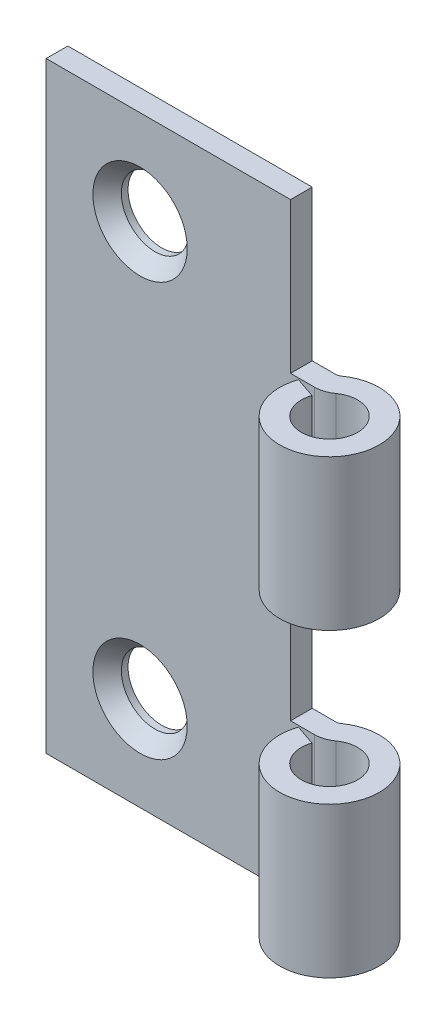
ISO-10303-21;
HEADER;
FILE_DESCRIPTION(('STEP AP214'),'2;1');
FILE_NAME('part.step','',(''),(''),'','','');
FILE_SCHEMA(('AUTOMOTIVE_DESIGN { 1 0 10303 214 1 1 1 1 }'));
ENDSEC;
DATA;
#1=APPLICATION_CONTEXT('core data for automotive mechanical design processes');
#2=APPLICATION_PROTOCOL_DEFINITION('international standard','automotive_design',2000,#1);
#3=PRODUCT_CONTEXT('',#1,'mechanical');
#4=PRODUCT('Part','Part','',(#3));
#5=PRODUCT_RELATED_PRODUCT_CATEGORY('part','',(#4));
#6=PRODUCT_DEFINITION_FORMATION('','',#4);
#7=PRODUCT_DEFINITION_CONTEXT('part definition',#1,'design');
#8=PRODUCT_DEFINITION('design','',#6,#7);
#9=PRODUCT_DEFINITION_SHAPE('','',#8);
#10=(LENGTH_UNIT() NAMED_UNIT(*) SI_UNIT(.MILLI.,.METRE.));
#11=(NAMED_UNIT(*) PLANE_ANGLE_UNIT() SI_UNIT($,.RADIAN.));
#12=(NAMED_UNIT(*) SI_UNIT($,.STERADIAN.) SOLID_ANGLE_UNIT());
#13=UNCERTAINTY_MEASURE_WITH_UNIT(LENGTH_MEASURE(1.E-05),#10,'distance_accuracy_value','');
#14=(GEOMETRIC_REPRESENTATION_CONTEXT(3) GLOBAL_UNCERTAINTY_ASSIGNED_CONTEXT((#13)) GLOBAL_UNIT_ASSIGNED_CONTEXT((#10,
#11,#12)) REPRESENTATION_CONTEXT('',''));
#15=CARTESIAN_POINT('',(0.,0.,0.));
#16=DIRECTION('',(0.,0.,1.));
#17=DIRECTION('',(1.,0.,0.));
#18=AXIS2_PLACEMENT_3D('',#15,#16,#17);
#19=CARTESIAN_POINT('',(-2.7667351517628,25.4,-3.8608));
#20=DIRECTION('',(0.,-1.,0.));
#21=DIRECTION('',(0.,0.,-1.));
#22=AXIS2_PLACEMENT_3D('',#19,#20,#21);
#23=CYLINDRICAL_SURFACE('',#22,2.3749);
#24=DIRECTION('',(0.,-1.,0.));
#25=VECTOR('',#24,1.);
#26=CARTESIAN_POINT('',(-1.38336757588139,25.4,-1.9304));
#27=LINE('',#26,#25);
#28=CARTESIAN_POINT('',(-1.3833675758814,-12.7,-1.9304));
#29=VERTEX_POINT('',#28);
#30=CARTESIAN_POINT('',(-1.3833675758814,-25.4,-1.9304));
#31=VERTEX_POINT('',#30);
#32=EDGE_CURVE('E209',#29,#31,#27,.T.);
#33=ORIENTED_EDGE('',*,*,#32,.F.);
#34=CARTESIAN_POINT('',(-2.7667351517628,-12.7,-3.8608));
#35=DIRECTION('',(0.,1.,0.));
#36=DIRECTION('',(0.,0.,1.));
#37=AXIS2_PLACEMENT_3D('',#34,#35,#36);
#38=CIRCLE('',#37,2.3749);
#39=CARTESIAN_POINT('',(-2.7667351517628,-12.7,-1.4859));
#40=VERTEX_POINT('',#39);
#41=EDGE_CURVE('E266',#29,#40,#38,.F.);
#42=ORIENTED_EDGE('',*,*,#41,.T.);
#43=DIRECTION('',(0.,-1.,0.));
#44=VECTOR('',#43,1.);
#45=CARTESIAN_POINT('',(-2.7667351517628,25.4,-1.4859));
#46=LINE('',#45,#44);
#47=CARTESIAN_POINT('',(-2.7667351517628,-25.4,-1.4859));
#48=VERTEX_POINT('',#47);
#49=EDGE_CURVE('E213',#40,#48,#46,.T.);
#50=ORIENTED_EDGE('',*,*,#49,.T.);
#51=CARTESIAN_POINT('',(-2.7667351517628,-25.4,-3.8608));
#52=DIRECTION('',(0.,-1.,0.));
#53=DIRECTION('',(0.,0.,-1.));
#54=AXIS2_PLACEMENT_3D('',#51,#52,#53);
#55=CIRCLE('',#54,2.3749);
#56=EDGE_CURVE('E307',#31,#48,#55,.T.);
#57=ORIENTED_EDGE('',*,*,#56,.F.);
#58=EDGE_LOOP('',(#33,#42,#50,#57));
#59=FACE_BOUND('',#58,.T.);
#60=ADVANCED_FACE('F41',(#59),#23,.T.);
#61=CARTESIAN_POINT('',(0.,25.4,0.));
#62=DIRECTION('',(0.,-1.,0.));
#63=DIRECTION('',(0.,0.,-1.));
#64=AXIS2_PLACEMENT_3D('',#61,#62,#63);
#65=CYLINDRICAL_SURFACE('',#64,2.3749);
#66=DIRECTION('',(0.,-1.,0.));
#67=VECTOR('',#66,1.);
#68=CARTESIAN_POINT('',(-2.24738976218141,25.4,-0.767716918429001));
#69=LINE('',#68,#67);
#70=CARTESIAN_POINT('',(-2.24738976218141,-12.7,-0.767716918429002));
#71=VERTEX_POINT('',#70);
#72=CARTESIAN_POINT('',(-2.24738976218141,-25.4,-0.767716918429002));
#73=VERTEX_POINT('',#72);
#74=EDGE_CURVE('E205',#71,#73,#69,.T.);
#75=ORIENTED_EDGE('',*,*,#74,.F.);
#76=CARTESIAN_POINT('',(0.,-12.7,0.));
#77=DIRECTION('',(0.,1.,0.));
#78=DIRECTION('',(0.,0.,1.));
#79=AXIS2_PLACEMENT_3D('',#76,#77,#78);
#80=CIRCLE('',#79,2.3749);
#81=EDGE_CURVE('E269',#71,#29,#80,.T.);
#82=ORIENTED_EDGE('',*,*,#81,.T.);
#83=ORIENTED_EDGE('',*,*,#32,.T.);
#84=CARTESIAN_POINT('',(0.,-25.4,0.));
#85=DIRECTION('',(0.,1.,0.));
#86=DIRECTION('',(0.,0.,1.));
#87=AXIS2_PLACEMENT_3D('',#84,#85,#86);
#88=CIRCLE('',#87,2.3749);
#89=EDGE_CURVE('E310',#73,#31,#88,.T.);
#90=ORIENTED_EDGE('',*,*,#89,.F.);
#91=EDGE_LOOP('',(#75,#82,#83,#90));
#92=FACE_BOUND('',#91,.T.);
#93=ADVANCED_FACE('F380',(#92),#65,.F.);
#94=CARTESIAN_POINT('',(-3.97800006033181,25.4,-1.3589));
#95=DIRECTION('',(0.323262839879153,0.,-0.946309218148732));
#96=DIRECTION('',(-0.946309218148733,0.,-0.323262839879153));
#97=AXIS2_PLACEMENT_3D('',#94,#95,#96);
#98=PLANE('',#97);
#99=DIRECTION('',(0.,-1.,0.));
#100=VECTOR('',#99,1.);
#101=CARTESIAN_POINT('',(-3.97800006033181,25.4,-1.3589));
#102=LINE('',#101,#100);
#103=CARTESIAN_POINT('',(-3.97800006033181,-12.7,-1.3589));
#104=VERTEX_POINT('',#103);
#105=CARTESIAN_POINT('',(-3.97800006033182,-25.4,-1.3589));
#106=VERTEX_POINT('',#105);
#107=EDGE_CURVE('E197',#104,#106,#102,.T.);
#108=ORIENTED_EDGE('',*,*,#107,.F.);
#109=DIRECTION('',(0.946309218148733,0.,0.323262839879153));
#110=VECTOR('',#109,1.);
#111=CARTESIAN_POINT('',(-3.97800006033181,-12.7,-1.3589));
#112=LINE('',#111,#110);
#113=EDGE_CURVE('E174',#104,#71,#112,.T.);
#114=ORIENTED_EDGE('',*,*,#113,.T.);
#115=ORIENTED_EDGE('',*,*,#74,.T.);
#116=DIRECTION('',(0.946309218148732,0.,0.323262839879153));
#117=VECTOR('',#116,1.);
#118=CARTESIAN_POINT('',(-3.97800006033182,-25.4,-1.3589));
#119=LINE('',#118,#117);
#120=EDGE_CURVE('E313',#106,#73,#119,.T.);
#121=ORIENTED_EDGE('',*,*,#120,.F.);
#122=EDGE_LOOP('',(#108,#114,#115,#121));
#123=FACE_BOUND('',#122,.T.);
#124=ADVANCED_FACE('F383',(#123),#98,.T.);
#125=CARTESIAN_POINT('',(0.,25.4,0.));
#126=DIRECTION('',(0.,-1.,0.));
#127=DIRECTION('',(0.,0.,-1.));
#128=AXIS2_PLACEMENT_3D('',#125,#126,#127);
#129=CYLINDRICAL_SURFACE('',#128,4.2037);
#130=DIRECTION('',(0.,-1.,0.));
#131=VECTOR('',#130,1.);
#132=CARTESIAN_POINT('',(-2.44863458618579,25.4,-3.41691122994652));
#133=LINE('',#132,#131);
#134=CARTESIAN_POINT('',(-2.4486345861858,-12.7,-3.41691122994652));
#135=VERTEX_POINT('',#134);
#136=CARTESIAN_POINT('',(-2.4486345861858,-25.4,-3.41691122994652));
#137=VERTEX_POINT('',#136);
#138=EDGE_CURVE('E184',#135,#137,#133,.T.);
#139=ORIENTED_EDGE('',*,*,#138,.F.);
#140=CARTESIAN_POINT('',(0.,-12.7,0.));
#141=DIRECTION('',(0.,1.,0.));
#142=DIRECTION('',(0.,0.,1.));
#143=AXIS2_PLACEMENT_3D('',#140,#141,#142);
#144=CIRCLE('',#143,4.20369999999999);
#145=EDGE_CURVE('E168',#104,#135,#144,.T.);
#146=ORIENTED_EDGE('',*,*,#145,.F.);
#147=ORIENTED_EDGE('',*,*,#107,.T.);
#148=CARTESIAN_POINT('',(0.,-25.4,0.));
#149=DIRECTION('',(0.,1.,0.));
#150=DIRECTION('',(1.,0.,0.));
#151=AXIS2_PLACEMENT_3D('',#148,#149,#150);
#152=CIRCLE('',#151,4.2037);
#153=EDGE_CURVE('E191',#106,#137,#152,.T.);
#154=ORIENTED_EDGE('',*,*,#153,.T.);
#155=EDGE_LOOP('',(#139,#146,#147,#154));
#156=FACE_BOUND('',#155,.T.);
#157=ADVANCED_FACE('F189',(#156),#129,.T.);
#158=CARTESIAN_POINT('',(-2.7667351517628,25.4,-3.8608));
#159=DIRECTION('',(0.,-1.,0.));
#160=DIRECTION('',(0.,0.,-1.));
#161=AXIS2_PLACEMENT_3D('',#158,#159,#160);
#162=CYLINDRICAL_SURFACE('',#161,0.5461);
#163=CARTESIAN_POINT('',(-2.7667351517628,-12.7,-3.8608));
#164=DIRECTION('',(0.,-1.,0.));
#165=DIRECTION('',(0.,0.,1.));
#166=AXIS2_PLACEMENT_3D('',#163,#164,#165);
#167=CIRCLE('',#166,0.5461);
#168=CARTESIAN_POINT('',(-2.7667351517628,-12.7,-3.3147));
#169=VERTEX_POINT('',#168);
#170=EDGE_CURVE('E171',#135,#169,#167,.T.);
#171=ORIENTED_EDGE('',*,*,#170,.F.);
#172=ORIENTED_EDGE('',*,*,#138,.T.);
#173=CARTESIAN_POINT('',(-2.7667351517628,-25.4,-3.8608));
#174=DIRECTION('',(0.,1.,0.));
#175=DIRECTION('',(1.,0.,0.));
#176=AXIS2_PLACEMENT_3D('',#173,#174,#175);
#177=CIRCLE('',#176,0.5461);
#178=CARTESIAN_POINT('',(-2.7667351517628,-25.4,-3.3147));
#179=VERTEX_POINT('',#178);
#180=EDGE_CURVE('E317',#137,#179,#177,.F.);
#181=ORIENTED_EDGE('',*,*,#180,.T.);
#182=DIRECTION('',(0.,-1.,0.));
#183=VECTOR('',#182,1.);
#184=CARTESIAN_POINT('',(-2.7667351517628,25.4,-3.3147));
#185=LINE('',#184,#183);
#186=EDGE_CURVE('E186',#169,#179,#185,.T.);
#187=ORIENTED_EDGE('',*,*,#186,.F.);
#188=EDGE_LOOP('',(#171,#172,#181,#187));
#189=FACE_BOUND('',#188,.T.);
#190=ADVANCED_FACE('F182',(#189),#162,.F.);
#191=CARTESIAN_POINT('',(-2.7667351517628,25.4,-3.3147));
#192=DIRECTION('',(0.,0.,1.));
#193=DIRECTION('',(1.,0.,0.));
#194=AXIS2_PLACEMENT_3D('',#191,#192,#193);
#195=PLANE('',#194);
#196=CARTESIAN_POINT('',(-17.4752,17.4498,-3.3147));
#197=DIRECTION('',(0.,0.,1.));
#198=DIRECTION('',(1.,0.,0.));
#199=AXIS2_PLACEMENT_3D('',#196,#197,#198);
#200=CIRCLE('',#199,2.8448);
#201=CARTESIAN_POINT('',(-14.6304,17.4498,-3.3147));
#202=VERTEX_POINT('',#201);
#203=EDGE_CURVE('E238',#202,#202,#200,.T.);
#204=ORIENTED_EDGE('',*,*,#203,.T.);
#205=EDGE_LOOP('',(#204));
#206=FACE_BOUND('',#205,.T.);
#207=CARTESIAN_POINT('',(-17.4752,-17.4498,-3.3147));
#208=DIRECTION('',(0.,0.,1.));
#209=DIRECTION('',(1.,0.,0.));
#210=AXIS2_PLACEMENT_3D('',#207,#208,#209);
#211=CIRCLE('',#210,2.8448);
#212=CARTESIAN_POINT('',(-14.6304,-17.4498,-3.3147));
#213=VERTEX_POINT('',#212);
#214=EDGE_CURVE('E227',#213,#213,#211,.T.);
#215=ORIENTED_EDGE('',*,*,#214,.T.);
#216=EDGE_LOOP('',(#215));
#217=FACE_BOUND('',#216,.T.);
#218=DIRECTION('',(-1.,0.,0.));
#219=VECTOR('',#218,1.);
#220=CARTESIAN_POINT('',(-3.97800006033181,-12.7,-3.3147));
#221=LINE('',#220,#219);
#222=CARTESIAN_POINT('',(-4.77175006033182,-12.7,-3.3147));
#223=VERTEX_POINT('',#222);
#224=EDGE_CURVE('E187',#169,#223,#221,.T.);
#225=ORIENTED_EDGE('',*,*,#224,.F.);
#226=ORIENTED_EDGE('',*,*,#186,.T.);
#227=DIRECTION('',(-1.,0.,0.));
#228=VECTOR('',#227,1.);
#229=CARTESIAN_POINT('',(-2.7667351517628,-25.4,-3.3147));
#230=LINE('',#229,#228);
#231=CARTESIAN_POINT('',(-25.4,-25.4,-3.3147));
#232=VERTEX_POINT('',#231);
#233=EDGE_CURVE('E298',#179,#232,#230,.T.);
#234=ORIENTED_EDGE('',*,*,#233,.T.);
#235=DIRECTION('',(0.,-1.,0.));
#236=VECTOR('',#235,1.);
#237=CARTESIAN_POINT('',(-25.4,25.4,-3.3147));
#238=LINE('',#237,#236);
#239=CARTESIAN_POINT('',(-25.4,25.4,-3.3147));
#240=VERTEX_POINT('',#239);
#241=EDGE_CURVE('E219',#240,#232,#238,.T.);
#242=ORIENTED_EDGE('',*,*,#241,.F.);
#243=DIRECTION('',(-1.,0.,0.));
#244=VECTOR('',#243,1.);
#245=CARTESIAN_POINT('',(-2.7667351517628,25.4,-3.3147));
#246=LINE('',#245,#244);
#247=CARTESIAN_POINT('',(-4.77175006033181,25.4,-3.3147));
#248=VERTEX_POINT('',#247);
#249=EDGE_CURVE('E319',#248,#240,#246,.T.);
#250=ORIENTED_EDGE('',*,*,#249,.F.);
#251=DIRECTION('',(0.,1.,0.));
#252=VECTOR('',#251,1.);
#253=CARTESIAN_POINT('',(-4.77175006033181,12.7,-3.3147));
#254=LINE('',#253,#252);
#255=CARTESIAN_POINT('',(-4.77175006033181,12.7,-3.3147));
#256=VERTEX_POINT('',#255);
#257=EDGE_CURVE('E58',#256,#248,#254,.T.);
#258=ORIENTED_EDGE('',*,*,#257,.F.);
#259=DIRECTION('',(-1.,0.,0.));
#260=VECTOR('',#259,1.);
#261=CARTESIAN_POINT('',(-3.97800006033181,12.7,-3.3147));
#262=LINE('',#261,#260);
#263=CARTESIAN_POINT('',(-2.7667351517628,12.7,-3.3147));
#264=VERTEX_POINT('',#263);
#265=EDGE_CURVE('E278',#264,#256,#262,.T.);
#266=ORIENTED_EDGE('',*,*,#265,.F.);
#267=CARTESIAN_POINT('',(-2.7667351517628,0.,-3.3147));
#268=VERTEX_POINT('',#267);
#269=EDGE_CURVE('E194',#264,#268,#185,.T.);
#270=ORIENTED_EDGE('',*,*,#269,.T.);
#271=DIRECTION('',(-1.,0.,0.));
#272=VECTOR('',#271,1.);
#273=CARTESIAN_POINT('',(-4.77175006033181,0.,-3.3147));
#274=LINE('',#273,#272);
#275=CARTESIAN_POINT('',(-4.77175006033181,0.,-3.3147));
#276=VERTEX_POINT('',#275);
#277=EDGE_CURVE('E251',#268,#276,#274,.T.);
#278=ORIENTED_EDGE('',*,*,#277,.T.);
#279=DIRECTION('',(0.,1.,0.));
#280=VECTOR('',#279,1.);
#281=CARTESIAN_POINT('',(-4.77175006033182,-12.7,-3.3147));
#282=LINE('',#281,#280);
#283=EDGE_CURVE('E246',#223,#276,#282,.T.);
#284=ORIENTED_EDGE('',*,*,#283,.F.);
#285=EDGE_LOOP('',(#225,#226,#234,#242,#250,#258,#266,#270,#278,#284));
#286=FACE_BOUND('',#285,.T.);
#287=ADVANCED_FACE('F43',(#206,#217,#286),#195,.F.);
#288=CARTESIAN_POINT('',(-2.7667351517628,25.4,-1.4859));
#289=DIRECTION('',(0.,0.,1.));
#290=DIRECTION('',(1.,0.,0.));
#291=AXIS2_PLACEMENT_3D('',#288,#289,#290);
#292=PLANE('',#291);
#293=CARTESIAN_POINT('',(-17.4752,-17.4498,-1.4859));
#294=DIRECTION('',(0.,0.,1.));
#295=DIRECTION('',(1.,0.,0.));
#296=AXIS2_PLACEMENT_3D('',#293,#294,#295);
#297=CIRCLE('',#296,3.98272);
#298=CARTESIAN_POINT('',(-13.49248,-17.4498,-1.4859));
#299=VERTEX_POINT('',#298);
#300=EDGE_CURVE('E223',#299,#299,#297,.T.);
#301=ORIENTED_EDGE('',*,*,#300,.F.);
#302=EDGE_LOOP('',(#301));
#303=FACE_BOUND('',#302,.T.);
#304=CARTESIAN_POINT('',(-17.4752,17.4498,-1.4859));
#305=DIRECTION('',(0.,0.,1.));
#306=DIRECTION('',(1.,0.,0.));
#307=AXIS2_PLACEMENT_3D('',#304,#305,#306);
#308=CIRCLE('',#307,3.98272);
#309=CARTESIAN_POINT('',(-13.49248,17.4498,-1.4859));
#310=VERTEX_POINT('',#309);
#311=EDGE_CURVE('E229',#310,#310,#308,.T.);
#312=ORIENTED_EDGE('',*,*,#311,.F.);
#313=EDGE_LOOP('',(#312));
#314=FACE_BOUND('',#313,.T.);
#315=ORIENTED_EDGE('',*,*,#49,.F.);
#316=DIRECTION('',(-1.,0.,0.));
#317=VECTOR('',#316,1.);
#318=CARTESIAN_POINT('',(-2.7667351517628,-12.7,-1.4859));
#319=LINE('',#318,#317);
#320=CARTESIAN_POINT('',(-4.77175006033182,-12.7,-1.4859));
#321=VERTEX_POINT('',#320);
#322=EDGE_CURVE('E11',#40,#321,#319,.T.);
#323=ORIENTED_EDGE('',*,*,#322,.T.);
#324=DIRECTION('',(0.,1.,0.));
#325=VECTOR('',#324,1.);
#326=CARTESIAN_POINT('',(-4.77175006033182,-12.7,-1.4859));
#327=LINE('',#326,#325);
#328=CARTESIAN_POINT('',(-4.77175006033181,0.,-1.4859));
#329=VERTEX_POINT('',#328);
#330=EDGE_CURVE('E256',#321,#329,#327,.T.);
#331=ORIENTED_EDGE('',*,*,#330,.T.);
#332=DIRECTION('',(-1.,0.,0.));
#333=VECTOR('',#332,1.);
#334=CARTESIAN_POINT('',(-2.7667351517628,0.,-1.4859));
#335=LINE('',#334,#333);
#336=CARTESIAN_POINT('',(-2.7667351517628,0.,-1.4859));
#337=VERTEX_POINT('',#336);
#338=EDGE_CURVE('E50',#337,#329,#335,.T.);
#339=ORIENTED_EDGE('',*,*,#338,.F.);
#340=CARTESIAN_POINT('',(-2.7667351517628,12.7,-1.4859));
#341=VERTEX_POINT('',#340);
#342=EDGE_CURVE('E214',#341,#337,#46,.T.);
#343=ORIENTED_EDGE('',*,*,#342,.F.);
#344=DIRECTION('',(-1.,0.,0.));
#345=VECTOR('',#344,1.);
#346=CARTESIAN_POINT('',(-2.7667351517628,12.7,-1.4859));
#347=LINE('',#346,#345);
#348=CARTESIAN_POINT('',(-4.77175006033181,12.7,-1.4859));
#349=VERTEX_POINT('',#348);
#350=EDGE_CURVE('E296',#341,#349,#347,.T.);
#351=ORIENTED_EDGE('',*,*,#350,.T.);
#352=DIRECTION('',(0.,1.,0.));
#353=VECTOR('',#352,1.);
#354=CARTESIAN_POINT('',(-4.77175006033181,12.7,-1.4859));
#355=LINE('',#354,#353);
#356=CARTESIAN_POINT('',(-4.77175006033181,25.4,-1.4859));
#357=VERTEX_POINT('',#356);
#358=EDGE_CURVE('E284',#349,#357,#355,.T.);
#359=ORIENTED_EDGE('',*,*,#358,.T.);
#360=DIRECTION('',(-1.,0.,0.));
#361=VECTOR('',#360,1.);
#362=CARTESIAN_POINT('',(-2.7667351517628,25.4,-1.4859));
#363=LINE('',#362,#361);
#364=CARTESIAN_POINT('',(-25.4,25.4,-1.4859));
#365=VERTEX_POINT('',#364);
#366=EDGE_CURVE('E66',#357,#365,#363,.T.);
#367=ORIENTED_EDGE('',*,*,#366,.T.);
#368=DIRECTION('',(0.,-1.,0.));
#369=VECTOR('',#368,1.);
#370=CARTESIAN_POINT('',(-25.4,25.4,-1.4859));
#371=LINE('',#370,#369);
#372=CARTESIAN_POINT('',(-25.4,-25.4,-1.4859));
#373=VERTEX_POINT('',#372);
#374=EDGE_CURVE('E217',#365,#373,#371,.T.);
#375=ORIENTED_EDGE('',*,*,#374,.T.);
#376=DIRECTION('',(-1.,0.,0.));
#377=VECTOR('',#376,1.);
#378=CARTESIAN_POINT('',(-2.7667351517628,-25.4,-1.4859));
#379=LINE('',#378,#377);
#380=EDGE_CURVE('E304',#48,#373,#379,.T.);
#381=ORIENTED_EDGE('',*,*,#380,.F.);
#382=EDGE_LOOP('',(#315,#323,#331,#339,#343,#351,#359,#367,#375,#381));
#383=FACE_BOUND('',#382,.T.);
#384=ADVANCED_FACE('F341',(#303,#314,#383),#292,.T.);
#385=CARTESIAN_POINT('',(-2.7667351517628,0.,-3.8608));
#386=DIRECTION('',(0.,1.,0.));
#387=DIRECTION('',(0.,0.,1.));
#388=AXIS2_PLACEMENT_3D('',#385,#386,#387);
#389=CIRCLE('',#388,2.3749);
#390=CARTESIAN_POINT('',(-1.38336757588139,0.,-1.9304));
#391=VERTEX_POINT('',#390);
#392=EDGE_CURVE('E259',#391,#337,#389,.F.);
#393=ORIENTED_EDGE('',*,*,#392,.F.);
#394=CARTESIAN_POINT('',(-1.38336757588139,12.7,-1.9304));
#395=VERTEX_POINT('',#394);
#396=EDGE_CURVE('E210',#395,#391,#27,.T.);
#397=ORIENTED_EDGE('',*,*,#396,.F.);
#398=CARTESIAN_POINT('',(-2.7667351517628,12.7,-3.8608));
#399=DIRECTION('',(0.,1.,0.));
#400=DIRECTION('',(0.,0.,1.));
#401=AXIS2_PLACEMENT_3D('',#398,#399,#400);
#402=CIRCLE('',#401,2.3749);
#403=EDGE_CURVE('E293',#395,#341,#402,.F.);
#404=ORIENTED_EDGE('',*,*,#403,.T.);
#405=ORIENTED_EDGE('',*,*,#342,.T.);
#406=EDGE_LOOP('',(#393,#397,#404,#405));
#407=FACE_BOUND('',#406,.T.);
#408=ADVANCED_FACE('F349',(#407),#23,.T.);
#409=CARTESIAN_POINT('',(0.,0.,0.));
#410=DIRECTION('',(0.,1.,0.));
#411=DIRECTION('',(0.,0.,1.));
#412=AXIS2_PLACEMENT_3D('',#409,#410,#411);
#413=CIRCLE('',#412,2.3749);
#414=CARTESIAN_POINT('',(-2.24738976218141,0.,-0.767716918429002));
#415=VERTEX_POINT('',#414);
#416=EDGE_CURVE('E262',#415,#391,#413,.T.);
#417=ORIENTED_EDGE('',*,*,#416,.F.);
#418=CARTESIAN_POINT('',(-2.24738976218141,12.7,-0.767716918429002));
#419=VERTEX_POINT('',#418);
#420=EDGE_CURVE('E206',#419,#415,#69,.T.);
#421=ORIENTED_EDGE('',*,*,#420,.F.);
#422=CARTESIAN_POINT('',(0.,12.7,0.));
#423=DIRECTION('',(0.,1.,0.));
#424=DIRECTION('',(0.,0.,1.));
#425=AXIS2_PLACEMENT_3D('',#422,#423,#424);
#426=CIRCLE('',#425,2.3749);
#427=EDGE_CURVE('E290',#419,#395,#426,.T.);
#428=ORIENTED_EDGE('',*,*,#427,.T.);
#429=ORIENTED_EDGE('',*,*,#396,.T.);
#430=EDGE_LOOP('',(#417,#421,#428,#429));
#431=FACE_BOUND('',#430,.T.);
#432=ADVANCED_FACE('F352',(#431),#65,.F.);
#433=DIRECTION('',(0.946309218148733,0.,0.323262839879153));
#434=VECTOR('',#433,1.);
#435=CARTESIAN_POINT('',(-3.97800006033181,0.,-1.3589));
#436=LINE('',#435,#434);
#437=CARTESIAN_POINT('',(-3.97800006033181,0.,-1.3589));
#438=VERTEX_POINT('',#437);
#439=EDGE_CURVE('E264',#438,#415,#436,.T.);
#440=ORIENTED_EDGE('',*,*,#439,.F.);
#441=CARTESIAN_POINT('',(-3.97800006033181,12.7,-1.3589));
#442=VERTEX_POINT('',#441);
#443=EDGE_CURVE('E202',#442,#438,#102,.T.);
#444=ORIENTED_EDGE('',*,*,#443,.F.);
#445=DIRECTION('',(0.946309218148733,0.,0.323262839879153));
#446=VECTOR('',#445,1.);
#447=CARTESIAN_POINT('',(-3.97800006033181,12.7,-1.3589));
#448=LINE('',#447,#446);
#449=EDGE_CURVE('E286',#442,#419,#448,.T.);
#450=ORIENTED_EDGE('',*,*,#449,.T.);
#451=ORIENTED_EDGE('',*,*,#420,.T.);
#452=EDGE_LOOP('',(#440,#444,#450,#451));
#453=FACE_BOUND('',#452,.T.);
#454=ADVANCED_FACE('F358',(#453),#98,.T.);
#455=CARTESIAN_POINT('',(0.,0.,0.));
#456=DIRECTION('',(0.,1.,0.));
#457=DIRECTION('',(0.,0.,1.));
#458=AXIS2_PLACEMENT_3D('',#455,#456,#457);
#459=CIRCLE('',#458,4.20369999999999);
#460=CARTESIAN_POINT('',(-2.44863458618579,0.,-3.41691122994652));
#461=VERTEX_POINT('',#460);
#462=EDGE_CURVE('E240',#438,#461,#459,.T.);
#463=ORIENTED_EDGE('',*,*,#462,.T.);
#464=CARTESIAN_POINT('',(-2.44863458618579,12.7,-3.41691122994652));
#465=VERTEX_POINT('',#464);
#466=EDGE_CURVE('E193',#465,#461,#133,.T.);
#467=ORIENTED_EDGE('',*,*,#466,.F.);
#468=CARTESIAN_POINT('',(0.,12.7,0.));
#469=DIRECTION('',(0.,1.,0.));
#470=DIRECTION('',(0.,0.,1.));
#471=AXIS2_PLACEMENT_3D('',#468,#469,#470);
#472=CIRCLE('',#471,4.20369999999999);
#473=EDGE_CURVE('E274',#442,#465,#472,.T.);
#474=ORIENTED_EDGE('',*,*,#473,.F.);
#475=ORIENTED_EDGE('',*,*,#443,.T.);
#476=EDGE_LOOP('',(#463,#467,#474,#475));
#477=FACE_BOUND('',#476,.T.);
#478=ADVANCED_FACE('F360',(#477),#129,.T.);
#479=ORIENTED_EDGE('',*,*,#466,.T.);
#480=CARTESIAN_POINT('',(-2.7667351517628,0.,-3.8608));
#481=DIRECTION('',(0.,-1.,0.));
#482=DIRECTION('',(0.,0.,1.));
#483=AXIS2_PLACEMENT_3D('',#480,#481,#482);
#484=CIRCLE('',#483,0.5461);
#485=EDGE_CURVE('E248',#461,#268,#484,.T.);
#486=ORIENTED_EDGE('',*,*,#485,.T.);
#487=ORIENTED_EDGE('',*,*,#269,.F.);
#488=CARTESIAN_POINT('',(-2.7667351517628,12.7,-3.8608));
#489=DIRECTION('',(0.,-1.,0.));
#490=DIRECTION('',(0.,0.,1.));
#491=AXIS2_PLACEMENT_3D('',#488,#489,#490);
#492=CIRCLE('',#491,0.5461);
#493=EDGE_CURVE('E276',#465,#264,#492,.T.);
#494=ORIENTED_EDGE('',*,*,#493,.F.);
#495=EDGE_LOOP('',(#479,#486,#487,#494));
#496=FACE_BOUND('',#495,.T.);
#497=ADVANCED_FACE('F366',(#496),#162,.F.);
#498=CARTESIAN_POINT('',(-25.4,25.4,-1.4859));
#499=DIRECTION('',(-1.,0.,0.));
#500=DIRECTION('',(0.,0.,1.));
#501=AXIS2_PLACEMENT_3D('',#498,#499,#500);
#502=PLANE('',#501);
#503=ORIENTED_EDGE('',*,*,#241,.T.);
#504=DIRECTION('',(0.,0.,-1.));
#505=VECTOR('',#504,1.);
#506=CARTESIAN_POINT('',(-25.4,-25.4,-1.4859));
#507=LINE('',#506,#505);
#508=EDGE_CURVE('E301',#373,#232,#507,.T.);
#509=ORIENTED_EDGE('',*,*,#508,.F.);
#510=ORIENTED_EDGE('',*,*,#374,.F.);
#511=DIRECTION('',(0.,0.,-1.));
#512=VECTOR('',#511,1.);
#513=CARTESIAN_POINT('',(-25.4,25.4,-1.4859));
#514=LINE('',#513,#512);
#515=EDGE_CURVE('E321',#365,#240,#514,.T.);
#516=ORIENTED_EDGE('',*,*,#515,.T.);
#517=EDGE_LOOP('',(#503,#509,#510,#516));
#518=FACE_BOUND('',#517,.T.);
#519=ADVANCED_FACE('F332',(#518),#502,.T.);
#520=CARTESIAN_POINT('',(-2.7667351517628,25.4,-3.8608));
#521=DIRECTION('',(0.,-1.,0.));
#522=DIRECTION('',(-1.,0.,0.));
#523=AXIS2_PLACEMENT_3D('',#520,#521,#522);
#524=PLANE('',#523);
#525=ORIENTED_EDGE('',*,*,#366,.F.);
#526=DIRECTION('',(0.,0.,1.));
#527=VECTOR('',#526,1.);
#528=CARTESIAN_POINT('',(-4.77175006033181,25.4,-1.4859));
#529=LINE('',#528,#527);
#530=EDGE_CURVE('E273',#248,#357,#529,.T.);
#531=ORIENTED_EDGE('',*,*,#530,.F.);
#532=ORIENTED_EDGE('',*,*,#249,.T.);
#533=ORIENTED_EDGE('',*,*,#515,.F.);
#534=EDGE_LOOP('',(#525,#531,#532,#533));
#535=FACE_BOUND('',#534,.T.);
#536=ADVANCED_FACE('F337',(#535),#524,.F.);
#537=CARTESIAN_POINT('',(-2.7667351517628,-25.4,-3.8608));
#538=DIRECTION('',(0.,-1.,0.));
#539=DIRECTION('',(-1.,0.,0.));
#540=AXIS2_PLACEMENT_3D('',#537,#538,#539);
#541=PLANE('',#540);
#542=ORIENTED_EDGE('',*,*,#233,.F.);
#543=ORIENTED_EDGE('',*,*,#180,.F.);
#544=ORIENTED_EDGE('',*,*,#153,.F.);
#545=ORIENTED_EDGE('',*,*,#120,.T.);
#546=ORIENTED_EDGE('',*,*,#89,.T.);
#547=ORIENTED_EDGE('',*,*,#56,.T.);
#548=ORIENTED_EDGE('',*,*,#380,.T.);
#549=ORIENTED_EDGE('',*,*,#508,.T.);
#550=EDGE_LOOP('',(#542,#543,#544,#545,#546,#547,#548,#549));
#551=FACE_BOUND('',#550,.T.);
#552=ADVANCED_FACE('F328',(#551),#541,.T.);
#553=CARTESIAN_POINT('',(0.,12.7,0.));
#554=DIRECTION('',(0.,1.,0.));
#555=DIRECTION('',(0.,0.,1.));
#556=AXIS2_PLACEMENT_3D('',#553,#554,#555);
#557=PLANE('',#556);
#558=ORIENTED_EDGE('',*,*,#403,.F.);
#559=ORIENTED_EDGE('',*,*,#427,.F.);
#560=ORIENTED_EDGE('',*,*,#449,.F.);
#561=ORIENTED_EDGE('',*,*,#473,.T.);
#562=ORIENTED_EDGE('',*,*,#493,.T.);
#563=ORIENTED_EDGE('',*,*,#265,.T.);
#564=DIRECTION('',(0.,0.,1.));
#565=VECTOR('',#564,1.);
#566=CARTESIAN_POINT('',(-4.77175006033181,12.7,-1.4859));
#567=LINE('',#566,#565);
#568=EDGE_CURVE('E280',#256,#349,#567,.T.);
#569=ORIENTED_EDGE('',*,*,#568,.T.);
#570=ORIENTED_EDGE('',*,*,#350,.F.);
#571=EDGE_LOOP('',(#558,#559,#560,#561,#562,#563,#569,#570));
#572=FACE_BOUND('',#571,.T.);
#573=ADVANCED_FACE('F345',(#572),#557,.T.);
#574=CARTESIAN_POINT('',(-4.77175006033181,12.7,-1.4859));
#575=DIRECTION('',(-1.,0.,0.));
#576=DIRECTION('',(0.,0.,1.));
#577=AXIS2_PLACEMENT_3D('',#574,#575,#576);
#578=PLANE('',#577);
#579=ORIENTED_EDGE('',*,*,#530,.T.);
#580=ORIENTED_EDGE('',*,*,#358,.F.);
#581=ORIENTED_EDGE('',*,*,#568,.F.);
#582=ORIENTED_EDGE('',*,*,#257,.T.);
#583=EDGE_LOOP('',(#579,#580,#581,#582));
#584=FACE_BOUND('',#583,.T.);
#585=ADVANCED_FACE('F339',(#584),#578,.F.);
#586=CARTESIAN_POINT('',(0.,-12.7,0.));
#587=DIRECTION('',(0.,1.,0.));
#588=DIRECTION('',(0.,0.,1.));
#589=AXIS2_PLACEMENT_3D('',#586,#587,#588);
#590=PLANE('',#589);
#591=ORIENTED_EDGE('',*,*,#145,.T.);
#592=ORIENTED_EDGE('',*,*,#170,.T.);
#593=ORIENTED_EDGE('',*,*,#224,.T.);
#594=DIRECTION('',(0.,0.,1.));
#595=VECTOR('',#594,1.);
#596=CARTESIAN_POINT('',(-4.77175006033182,-12.7,-1.4859));
#597=LINE('',#596,#595);
#598=EDGE_CURVE('E243',#223,#321,#597,.T.);
#599=ORIENTED_EDGE('',*,*,#598,.T.);
#600=ORIENTED_EDGE('',*,*,#322,.F.);
#601=ORIENTED_EDGE('',*,*,#41,.F.);
#602=ORIENTED_EDGE('',*,*,#81,.F.);
#603=ORIENTED_EDGE('',*,*,#113,.F.);
#604=EDGE_LOOP('',(#591,#592,#593,#599,#600,#601,#602,#603));
#605=FACE_BOUND('',#604,.T.);
#606=ADVANCED_FACE('F170',(#605),#590,.T.);
#607=CARTESIAN_POINT('',(0.,0.,0.));
#608=DIRECTION('',(0.,1.,0.));
#609=DIRECTION('',(0.,0.,1.));
#610=AXIS2_PLACEMENT_3D('',#607,#608,#609);
#611=PLANE('',#610);
#612=ORIENTED_EDGE('',*,*,#462,.F.);
#613=ORIENTED_EDGE('',*,*,#439,.T.);
#614=ORIENTED_EDGE('',*,*,#416,.T.);
#615=ORIENTED_EDGE('',*,*,#392,.T.);
#616=ORIENTED_EDGE('',*,*,#338,.T.);
#617=DIRECTION('',(0.,0.,1.));
#618=VECTOR('',#617,1.);
#619=CARTESIAN_POINT('',(-4.77175006033181,0.,-1.4859));
#620=LINE('',#619,#618);
#621=EDGE_CURVE('E178',#276,#329,#620,.T.);
#622=ORIENTED_EDGE('',*,*,#621,.F.);
#623=ORIENTED_EDGE('',*,*,#277,.F.);
#624=ORIENTED_EDGE('',*,*,#485,.F.);
#625=EDGE_LOOP('',(#612,#613,#614,#615,#616,#622,#623,#624));
#626=FACE_BOUND('',#625,.T.);
#627=ADVANCED_FACE('F369',(#626),#611,.F.);
#628=CARTESIAN_POINT('',(-4.77175006033182,-12.7,-1.4859));
#629=DIRECTION('',(-1.,0.,0.));
#630=DIRECTION('',(0.,0.,1.));
#631=AXIS2_PLACEMENT_3D('',#628,#629,#630);
#632=PLANE('',#631);
#633=ORIENTED_EDGE('',*,*,#621,.T.);
#634=ORIENTED_EDGE('',*,*,#330,.F.);
#635=ORIENTED_EDGE('',*,*,#598,.F.);
#636=ORIENTED_EDGE('',*,*,#283,.T.);
#637=EDGE_LOOP('',(#633,#634,#635,#636));
#638=FACE_BOUND('',#637,.T.);
#639=ADVANCED_FACE('F372',(#638),#632,.F.);
#640=CARTESIAN_POINT('',(-17.4752,-17.4498,-4.2037));
#641=DIRECTION('',(0.,0.,1.));
#642=DIRECTION('',(1.,0.,0.));
#643=AXIS2_PLACEMENT_3D('',#640,#641,#642);
#644=CYLINDRICAL_SURFACE('',#643,2.8448);
#645=CARTESIAN_POINT('',(-17.4752,-17.4498,-2.74968819287443));
#646=DIRECTION('',(0.,0.,1.));
#647=DIRECTION('',(1.,0.,0.));
#648=AXIS2_PLACEMENT_3D('',#645,#646,#647);
#649=CIRCLE('',#648,2.8448);
#650=CARTESIAN_POINT('',(-14.6304,-17.4498,-2.74968819287443));
#651=VERTEX_POINT('',#650);
#652=EDGE_CURVE('E45',#651,#651,#649,.T.);
#653=ORIENTED_EDGE('',*,*,#652,.T.);
#654=EDGE_LOOP('',(#653));
#655=FACE_BOUND('',#654,.T.);
#656=ORIENTED_EDGE('',*,*,#214,.F.);
#657=EDGE_LOOP('',(#656));
#658=FACE_BOUND('',#657,.T.);
#659=ADVANCED_FACE('F466',(#655,#658),#644,.F.);
#660=CARTESIAN_POINT('',(-17.4752,17.4498,-4.2037));
#661=DIRECTION('',(0.,0.,1.));
#662=DIRECTION('',(1.,0.,0.));
#663=AXIS2_PLACEMENT_3D('',#660,#661,#662);
#664=CYLINDRICAL_SURFACE('',#663,2.8448);
#665=CARTESIAN_POINT('',(-17.4752,17.4498,-2.74968819287443));
#666=DIRECTION('',(0.,0.,1.));
#667=DIRECTION('',(1.,0.,0.));
#668=AXIS2_PLACEMENT_3D('',#665,#666,#667);
#669=CIRCLE('',#668,2.8448);
#670=CARTESIAN_POINT('',(-14.6304,17.4498,-2.74968819287443));
#671=VERTEX_POINT('',#670);
#672=EDGE_CURVE('E221',#671,#671,#669,.T.);
#673=ORIENTED_EDGE('',*,*,#672,.T.);
#674=EDGE_LOOP('',(#673));
#675=FACE_BOUND('',#674,.T.);
#676=ORIENTED_EDGE('',*,*,#203,.F.);
#677=EDGE_LOOP('',(#676));
#678=FACE_BOUND('',#677,.T.);
#679=ADVANCED_FACE('F474',(#675,#678),#664,.F.);
#680=CARTESIAN_POINT('',(-17.4752,17.4498,-1.4859));
#681=DIRECTION('',(0.,0.,1.));
#682=DIRECTION('',(1.,0.,0.));
#683=AXIS2_PLACEMENT_3D('',#680,#681,#682);
#684=CONICAL_SURFACE('',#683,3.98272,0.73303828583762);
#685=ORIENTED_EDGE('',*,*,#311,.T.);
#686=EDGE_LOOP('',(#685));
#687=FACE_BOUND('',#686,.T.);
#688=ORIENTED_EDGE('',*,*,#672,.F.);
#689=EDGE_LOOP('',(#688));
#690=FACE_BOUND('',#689,.T.);
#691=ADVANCED_FACE('F483',(#687,#690),#684,.F.);
#692=CARTESIAN_POINT('',(-17.4752,-17.4498,-1.4859));
#693=DIRECTION('',(0.,0.,1.));
#694=DIRECTION('',(1.,0.,0.));
#695=AXIS2_PLACEMENT_3D('',#692,#693,#694);
#696=CONICAL_SURFACE('',#695,3.98272,0.73303828583762);
#697=ORIENTED_EDGE('',*,*,#300,.T.);
#698=EDGE_LOOP('',(#697));
#699=FACE_BOUND('',#698,.T.);
#700=ORIENTED_EDGE('',*,*,#652,.F.);
#701=EDGE_LOOP('',(#700));
#702=FACE_BOUND('',#701,.T.);
#703=ADVANCED_FACE('F491',(#699,#702),#696,.F.);
#704=CLOSED_SHELL('',(#60,#93,#124,#157,#190,#287,#384,#408,#432,#454,#478,#497,#519,#536,#552,
#573,#585,#606,#627,#639,#659,#679,#691,#703));
#705=MANIFOLD_SOLID_BREP('B2',#704);
#706=ADVANCED_BREP_SHAPE_REPRESENTATION('',(#18,#705),#14);
#707=SHAPE_DEFINITION_REPRESENTATION(#9,#706);
ENDSEC;
END-ISO-10303-21;
